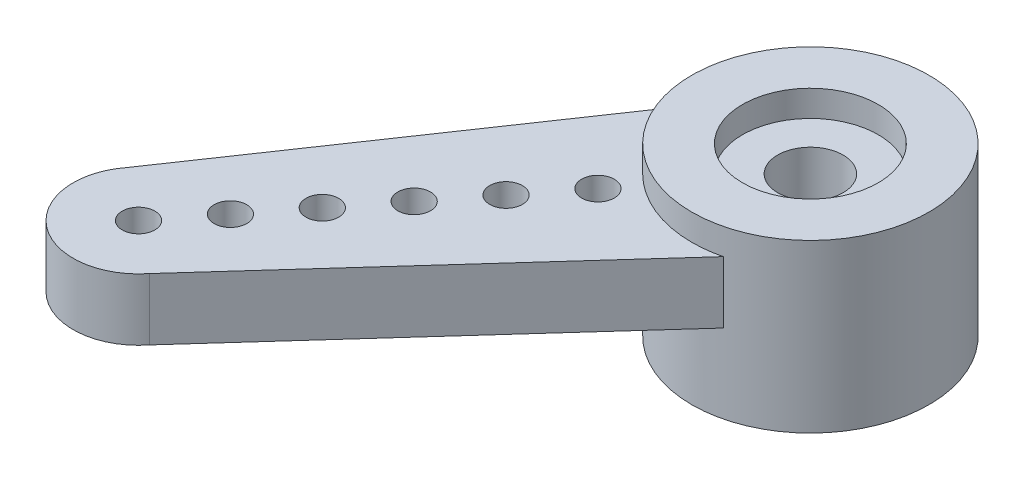
ISO-10303-21;
HEADER;
FILE_DESCRIPTION(('STEP AP214'),'2;1');
FILE_NAME('part.step','',(''),(''),'','','');
FILE_SCHEMA(('AUTOMOTIVE_DESIGN { 1 0 10303 214 1 1 1 1 }'));
ENDSEC;
DATA;
#1=APPLICATION_CONTEXT('core data for automotive mechanical design processes');
#2=APPLICATION_PROTOCOL_DEFINITION('international standard','automotive_design',2000,#1);
#3=PRODUCT_CONTEXT('',#1,'mechanical');
#4=PRODUCT('Part','Part','',(#3));
#5=PRODUCT_RELATED_PRODUCT_CATEGORY('part','',(#4));
#6=PRODUCT_DEFINITION_FORMATION('','',#4);
#7=PRODUCT_DEFINITION_CONTEXT('part definition',#1,'design');
#8=PRODUCT_DEFINITION('design','',#6,#7);
#9=PRODUCT_DEFINITION_SHAPE('','',#8);
#10=(LENGTH_UNIT() NAMED_UNIT(*) SI_UNIT(.MILLI.,.METRE.));
#11=(NAMED_UNIT(*) PLANE_ANGLE_UNIT() SI_UNIT($,.RADIAN.));
#12=(NAMED_UNIT(*) SI_UNIT($,.STERADIAN.) SOLID_ANGLE_UNIT());
#13=UNCERTAINTY_MEASURE_WITH_UNIT(LENGTH_MEASURE(1.E-05),#10,'distance_accuracy_value','');
#14=(GEOMETRIC_REPRESENTATION_CONTEXT(3) GLOBAL_UNCERTAINTY_ASSIGNED_CONTEXT((#13)) GLOBAL_UNIT_ASSIGNED_CONTEXT((#10,
#11,#12)) REPRESENTATION_CONTEXT('',''));
#15=CARTESIAN_POINT('',(0.,0.,0.));
#16=DIRECTION('',(0.,0.,1.));
#17=DIRECTION('',(1.,0.,0.));
#18=AXIS2_PLACEMENT_3D('',#15,#16,#17);
#19=CARTESIAN_POINT('',(0.,4.3,0.));
#20=DIRECTION('',(0.,1.,0.));
#21=DIRECTION('',(0.,0.,1.));
#22=AXIS2_PLACEMENT_3D('',#19,#20,#21);
#23=PLANE('',#22);
#24=CARTESIAN_POINT('',(0.,4.3,0.));
#25=DIRECTION('',(0.,1.,0.));
#26=DIRECTION('',(0.,0.,1.));
#27=AXIS2_PLACEMENT_3D('',#24,#25,#26);
#28=CIRCLE('',#27,1.);
#29=CARTESIAN_POINT('',(0.,4.3,1.));
#30=VERTEX_POINT('',#29);
#31=EDGE_CURVE('E124',#30,#30,#28,.T.);
#32=ORIENTED_EDGE('',*,*,#31,.F.);
#33=EDGE_LOOP('',(#32));
#34=FACE_BOUND('',#33,.T.);
#35=CARTESIAN_POINT('',(0.,4.3,0.));
#36=DIRECTION('',(0.,1.,0.));
#37=DIRECTION('',(0.,0.,1.));
#38=AXIS2_PLACEMENT_3D('',#35,#36,#37);
#39=CIRCLE('',#38,2.075);
#40=CARTESIAN_POINT('',(0.,4.3,2.075));
#41=VERTEX_POINT('',#40);
#42=EDGE_CURVE('E341',#41,#41,#39,.T.);
#43=ORIENTED_EDGE('',*,*,#42,.T.);
#44=EDGE_LOOP('',(#43));
#45=FACE_BOUND('',#44,.T.);
#46=ADVANCED_FACE('F33',(#34,#45),#23,.T.);
#47=CARTESIAN_POINT('',(0.,0.,0.));
#48=DIRECTION('',(0.,1.,0.));
#49=DIRECTION('',(0.,0.,1.));
#50=AXIS2_PLACEMENT_3D('',#47,#48,#49);
#51=PLANE('',#50);
#52=CARTESIAN_POINT('',(0.,0.,0.));
#53=DIRECTION('',(0.,1.,0.));
#54=DIRECTION('',(0.,0.,1.));
#55=AXIS2_PLACEMENT_3D('',#52,#53,#54);
#56=CIRCLE('',#55,3.625);
#57=CARTESIAN_POINT('',(0.,0.,3.625));
#58=VERTEX_POINT('',#57);
#59=EDGE_CURVE('E140',#58,#58,#56,.T.);
#60=ORIENTED_EDGE('',*,*,#59,.F.);
#61=EDGE_LOOP('',(#60));
#62=FACE_BOUND('',#61,.T.);
#63=CARTESIAN_POINT('',(0.,0.,0.));
#64=DIRECTION('',(0.,1.,0.));
#65=DIRECTION('',(0.,0.,1.));
#66=AXIS2_PLACEMENT_3D('',#63,#64,#65);
#67=CIRCLE('',#66,2.075);
#68=CARTESIAN_POINT('',(0.,0.,2.075));
#69=VERTEX_POINT('',#68);
#70=EDGE_CURVE('E98',#69,#69,#67,.T.);
#71=ORIENTED_EDGE('',*,*,#70,.T.);
#72=EDGE_LOOP('',(#71));
#73=FACE_BOUND('',#72,.T.);
#74=ADVANCED_FACE('F146',(#62,#73),#51,.F.);
#75=CARTESIAN_POINT('',(0.,2.41,0.));
#76=DIRECTION('',(0.,-1.,0.));
#77=DIRECTION('',(0.,0.,-1.));
#78=AXIS2_PLACEMENT_3D('',#75,#76,#77);
#79=CYLINDRICAL_SURFACE('',#78,3.625);
#80=CARTESIAN_POINT('',(0.,2.41,0.));
#81=DIRECTION('',(0.,1.,0.));
#82=DIRECTION('',(0.,0.,1.));
#83=AXIS2_PLACEMENT_3D('',#80,#81,#82);
#84=CIRCLE('',#83,3.625);
#85=CARTESIAN_POINT('',(-3.625,2.41,0.));
#86=VERTEX_POINT('',#85);
#87=CARTESIAN_POINT('',(0.859585555161717,2.41,3.52161009672526));
#88=VERTEX_POINT('',#87);
#89=EDGE_CURVE('E42',#86,#88,#84,.T.);
#90=ORIENTED_EDGE('',*,*,#89,.F.);
#91=DIRECTION('',(0.,-1.,0.));
#92=VECTOR('',#91,1.);
#93=CARTESIAN_POINT('',(-3.625,4.3,0.));
#94=LINE('',#93,#92);
#95=CARTESIAN_POINT('',(-3.625,4.3,0.));
#96=VERTEX_POINT('',#95);
#97=EDGE_CURVE('E92',#96,#86,#94,.T.);
#98=ORIENTED_EDGE('',*,*,#97,.F.);
#99=CARTESIAN_POINT('',(0.,4.3,0.));
#100=DIRECTION('',(0.,1.,0.));
#101=DIRECTION('',(0.,0.,1.));
#102=AXIS2_PLACEMENT_3D('',#99,#100,#101);
#103=CIRCLE('',#102,3.625);
#104=CARTESIAN_POINT('',(0.859585555161719,4.3,3.52161009672526));
#105=VERTEX_POINT('',#104);
#106=EDGE_CURVE('E11',#96,#105,#103,.T.);
#107=ORIENTED_EDGE('',*,*,#106,.T.);
#108=DIRECTION('',(0.,-1.,0.));
#109=VECTOR('',#108,1.);
#110=CARTESIAN_POINT('',(0.859585555161717,4.3,3.52161009672526));
#111=LINE('',#110,#109);
#112=EDGE_CURVE('E80',#105,#88,#111,.T.);
#113=ORIENTED_EDGE('',*,*,#112,.T.);
#114=EDGE_LOOP('',(#90,#98,#107,#113));
#115=FACE_BOUND('',#114,.T.);
#116=ORIENTED_EDGE('',*,*,#59,.T.);
#117=EDGE_LOOP('',(#116));
#118=FACE_BOUND('',#117,.T.);
#119=CARTESIAN_POINT('',(0.,5.1,0.));
#120=DIRECTION('',(0.,1.,0.));
#121=DIRECTION('',(0.,0.,1.));
#122=AXIS2_PLACEMENT_3D('',#119,#120,#121);
#123=CIRCLE('',#122,3.625);
#124=CARTESIAN_POINT('',(0.,5.1,3.625));
#125=VERTEX_POINT('',#124);
#126=EDGE_CURVE('E343',#125,#125,#123,.T.);
#127=ORIENTED_EDGE('',*,*,#126,.F.);
#128=EDGE_LOOP('',(#127));
#129=FACE_BOUND('',#128,.T.);
#130=ADVANCED_FACE('F35',(#115,#118,#129),#79,.T.);
#131=CARTESIAN_POINT('',(0.,2.41,0.));
#132=DIRECTION('',(0.,-1.,0.));
#133=DIRECTION('',(0.,0.,-1.));
#134=AXIS2_PLACEMENT_3D('',#131,#132,#133);
#135=CYLINDRICAL_SURFACE('',#134,2.075);
#136=CARTESIAN_POINT('',(0.,2.41,0.));
#137=DIRECTION('',(0.,1.,0.));
#138=DIRECTION('',(0.,0.,1.));
#139=AXIS2_PLACEMENT_3D('',#136,#137,#138);
#140=CIRCLE('',#139,2.075);
#141=CARTESIAN_POINT('',(0.,2.41,2.075));
#142=VERTEX_POINT('',#141);
#143=EDGE_CURVE('E94',#142,#142,#140,.T.);
#144=ORIENTED_EDGE('',*,*,#143,.T.);
#145=EDGE_LOOP('',(#144));
#146=FACE_BOUND('',#145,.T.);
#147=ORIENTED_EDGE('',*,*,#70,.F.);
#148=EDGE_LOOP('',(#147));
#149=FACE_BOUND('',#148,.T.);
#150=ADVANCED_FACE('F151',(#146,#149),#135,.F.);
#151=CARTESIAN_POINT('',(0.,2.41,0.));
#152=DIRECTION('',(0.,1.,0.));
#153=DIRECTION('',(0.,0.,1.));
#154=AXIS2_PLACEMENT_3D('',#151,#152,#153);
#155=PLANE('',#154);
#156=CARTESIAN_POINT('',(-9.03247950828862,2.41,11.5023884012124));
#157=DIRECTION('',(0.,1.,0.));
#158=DIRECTION('',(0.,0.,1.));
#159=AXIS2_PLACEMENT_3D('',#156,#157,#158);
#160=CIRCLE('',#159,0.500000000000001);
#161=CARTESIAN_POINT('',(-9.03247950828862,2.41,12.0023884012124));
#162=VERTEX_POINT('',#161);
#163=EDGE_CURVE('E134',#162,#162,#160,.T.);
#164=ORIENTED_EDGE('',*,*,#163,.T.);
#165=EDGE_LOOP('',(#164));
#166=FACE_BOUND('',#165,.T.);
#167=CARTESIAN_POINT('',(-7.79726863536026,2.41,9.92941220959363));
#168=DIRECTION('',(0.,1.,0.));
#169=DIRECTION('',(0.,0.,1.));
#170=AXIS2_PLACEMENT_3D('',#167,#168,#169);
#171=CIRCLE('',#170,0.5);
#172=CARTESIAN_POINT('',(-7.79726863536026,2.41,10.4294122095936));
#173=VERTEX_POINT('',#172);
#174=EDGE_CURVE('E370',#173,#173,#171,.T.);
#175=ORIENTED_EDGE('',*,*,#174,.T.);
#176=EDGE_LOOP('',(#175));
#177=FACE_BOUND('',#176,.T.);
#178=CARTESIAN_POINT('',(-6.5620577624319,2.41,8.35643601797484));
#179=DIRECTION('',(0.,1.,0.));
#180=DIRECTION('',(0.,0.,1.));
#181=AXIS2_PLACEMENT_3D('',#178,#179,#180);
#182=CIRCLE('',#181,0.500000000000001);
#183=CARTESIAN_POINT('',(-6.5620577624319,2.41,8.85643601797484));
#184=VERTEX_POINT('',#183);
#185=EDGE_CURVE('E364',#184,#184,#182,.T.);
#186=ORIENTED_EDGE('',*,*,#185,.T.);
#187=EDGE_LOOP('',(#186));
#188=FACE_BOUND('',#187,.T.);
#189=CARTESIAN_POINT('',(-5.32684688950354,2.41,6.78345982635605));
#190=DIRECTION('',(0.,1.,0.));
#191=DIRECTION('',(0.,0.,1.));
#192=AXIS2_PLACEMENT_3D('',#189,#190,#191);
#193=CIRCLE('',#192,0.5);
#194=CARTESIAN_POINT('',(-5.32684688950354,2.41,7.28345982635605));
#195=VERTEX_POINT('',#194);
#196=EDGE_CURVE('E358',#195,#195,#193,.T.);
#197=ORIENTED_EDGE('',*,*,#196,.T.);
#198=EDGE_LOOP('',(#197));
#199=FACE_BOUND('',#198,.T.);
#200=CARTESIAN_POINT('',(-4.09163601657519,2.41,5.21048363473725));
#201=DIRECTION('',(0.,1.,0.));
#202=DIRECTION('',(0.,0.,1.));
#203=AXIS2_PLACEMENT_3D('',#200,#201,#202);
#204=CIRCLE('',#203,0.5);
#205=CARTESIAN_POINT('',(-4.09163601657519,2.41,5.71048363473725));
#206=VERTEX_POINT('',#205);
#207=EDGE_CURVE('E352',#206,#206,#204,.T.);
#208=ORIENTED_EDGE('',*,*,#207,.T.);
#209=EDGE_LOOP('',(#208));
#210=FACE_BOUND('',#209,.T.);
#211=CARTESIAN_POINT('',(-2.85642514364683,2.41,3.63750744311846));
#212=DIRECTION('',(0.,1.,0.));
#213=DIRECTION('',(0.,0.,1.));
#214=AXIS2_PLACEMENT_3D('',#211,#212,#213);
#215=CIRCLE('',#214,0.5);
#216=CARTESIAN_POINT('',(-2.85642514364683,2.41,4.13750744311846));
#217=VERTEX_POINT('',#216);
#218=EDGE_CURVE('E348',#217,#217,#215,.T.);
#219=ORIENTED_EDGE('',*,*,#218,.T.);
#220=EDGE_LOOP('',(#219));
#221=FACE_BOUND('',#220,.T.);
#222=DIRECTION('',(-0.562242548605768,0.,0.826972379549215));
#223=VECTOR('',#222,1.);
#224=CARTESIAN_POINT('',(-10.6054556999074,2.41,10.2671775282841));
#225=LINE('',#224,#223);
#226=CARTESIAN_POINT('',(-10.6054556999074,2.41,10.2671775282841));
#227=VERTEX_POINT('',#226);
#228=EDGE_CURVE('E116',#86,#227,#225,.T.);
#229=ORIENTED_EDGE('',*,*,#228,.F.);
#230=ORIENTED_EDGE('',*,*,#89,.T.);
#231=DIRECTION('',(0.670063091932306,0.,-0.742304151160505));
#232=VECTOR('',#231,1.);
#233=CARTESIAN_POINT('',(-7.45950331666982,2.41,12.7375992741408));
#234=LINE('',#233,#232);
#235=CARTESIAN_POINT('',(-7.45950331666982,2.41,12.7375992741408));
#236=VERTEX_POINT('',#235);
#237=EDGE_CURVE('E84',#236,#88,#234,.T.);
#238=ORIENTED_EDGE('',*,*,#237,.F.);
#239=CARTESIAN_POINT('',(-9.03247950828862,2.41,11.5023884012124));
#240=DIRECTION('',(0.,1.,0.));
#241=DIRECTION('',(0.,0.,1.));
#242=AXIS2_PLACEMENT_3D('',#239,#240,#241);
#243=CIRCLE('',#242,2.);
#244=EDGE_CURVE('E114',#227,#236,#243,.T.);
#245=ORIENTED_EDGE('',*,*,#244,.F.);
#246=EDGE_LOOP('',(#229,#230,#238,#245));
#247=FACE_BOUND('',#246,.T.);
#248=ADVANCED_FACE('F153',(#166,#177,#188,#199,#210,#221,#247),#155,.F.);
#249=ORIENTED_EDGE('',*,*,#106,.F.);
#250=DIRECTION('',(-0.562242548605768,0.,0.826972379549215));
#251=VECTOR('',#250,1.);
#252=CARTESIAN_POINT('',(-10.6054556999074,4.3,10.2671775282841));
#253=LINE('',#252,#251);
#254=CARTESIAN_POINT('',(-10.6054556999074,4.3,10.2671775282841));
#255=VERTEX_POINT('',#254);
#256=EDGE_CURVE('E111',#96,#255,#253,.T.);
#257=ORIENTED_EDGE('',*,*,#256,.T.);
#258=CARTESIAN_POINT('',(-9.03247950828862,4.3,11.5023884012124));
#259=DIRECTION('',(0.,1.,0.));
#260=DIRECTION('',(0.,0.,1.));
#261=AXIS2_PLACEMENT_3D('',#258,#259,#260);
#262=CIRCLE('',#261,2.);
#263=CARTESIAN_POINT('',(-7.45950331666982,4.3,12.7375992741408));
#264=VERTEX_POINT('',#263);
#265=EDGE_CURVE('E58',#255,#264,#262,.T.);
#266=ORIENTED_EDGE('',*,*,#265,.T.);
#267=DIRECTION('',(0.670063091932306,0.,-0.742304151160505));
#268=VECTOR('',#267,1.);
#269=CARTESIAN_POINT('',(-7.45950331666982,4.3,12.7375992741408));
#270=LINE('',#269,#268);
#271=EDGE_CURVE('E83',#264,#105,#270,.T.);
#272=ORIENTED_EDGE('',*,*,#271,.T.);
#273=EDGE_LOOP('',(#249,#257,#266,#272));
#274=FACE_BOUND('',#273,.T.);
#275=CARTESIAN_POINT('',(-4.09163601657519,4.3,5.21048363473725));
#276=DIRECTION('',(0.,1.,0.));
#277=DIRECTION('',(0.,0.,1.));
#278=AXIS2_PLACEMENT_3D('',#275,#276,#277);
#279=CIRCLE('',#278,0.5);
#280=CARTESIAN_POINT('',(-4.09163601657519,4.3,5.71048363473725));
#281=VERTEX_POINT('',#280);
#282=EDGE_CURVE('E355',#281,#281,#279,.T.);
#283=ORIENTED_EDGE('',*,*,#282,.F.);
#284=EDGE_LOOP('',(#283));
#285=FACE_BOUND('',#284,.T.);
#286=CARTESIAN_POINT('',(-6.5620577624319,4.3,8.35643601797484));
#287=DIRECTION('',(0.,1.,0.));
#288=DIRECTION('',(0.,0.,1.));
#289=AXIS2_PLACEMENT_3D('',#286,#287,#288);
#290=CIRCLE('',#289,0.500000000000001);
#291=CARTESIAN_POINT('',(-6.5620577624319,4.3,8.85643601797484));
#292=VERTEX_POINT('',#291);
#293=EDGE_CURVE('E367',#292,#292,#290,.T.);
#294=ORIENTED_EDGE('',*,*,#293,.F.);
#295=EDGE_LOOP('',(#294));
#296=FACE_BOUND('',#295,.T.);
#297=CARTESIAN_POINT('',(-9.03247950828862,4.3,11.5023884012124));
#298=DIRECTION('',(0.,1.,0.));
#299=DIRECTION('',(0.,0.,1.));
#300=AXIS2_PLACEMENT_3D('',#297,#298,#299);
#301=CIRCLE('',#300,0.500000000000001);
#302=CARTESIAN_POINT('',(-9.03247950828862,4.3,12.0023884012124));
#303=VERTEX_POINT('',#302);
#304=EDGE_CURVE('E131',#303,#303,#301,.T.);
#305=ORIENTED_EDGE('',*,*,#304,.F.);
#306=EDGE_LOOP('',(#305));
#307=FACE_BOUND('',#306,.T.);
#308=CARTESIAN_POINT('',(-7.79726863536026,4.3,9.92941220959363));
#309=DIRECTION('',(0.,1.,0.));
#310=DIRECTION('',(0.,0.,1.));
#311=AXIS2_PLACEMENT_3D('',#308,#309,#310);
#312=CIRCLE('',#311,0.5);
#313=CARTESIAN_POINT('',(-7.79726863536026,4.3,10.4294122095936));
#314=VERTEX_POINT('',#313);
#315=EDGE_CURVE('E373',#314,#314,#312,.T.);
#316=ORIENTED_EDGE('',*,*,#315,.F.);
#317=EDGE_LOOP('',(#316));
#318=FACE_BOUND('',#317,.T.);
#319=CARTESIAN_POINT('',(-5.32684688950354,4.3,6.78345982635605));
#320=DIRECTION('',(0.,1.,0.));
#321=DIRECTION('',(0.,0.,1.));
#322=AXIS2_PLACEMENT_3D('',#319,#320,#321);
#323=CIRCLE('',#322,0.5);
#324=CARTESIAN_POINT('',(-5.32684688950354,4.3,7.28345982635605));
#325=VERTEX_POINT('',#324);
#326=EDGE_CURVE('E361',#325,#325,#323,.T.);
#327=ORIENTED_EDGE('',*,*,#326,.F.);
#328=EDGE_LOOP('',(#327));
#329=FACE_BOUND('',#328,.T.);
#330=CARTESIAN_POINT('',(-2.85642514364683,4.3,3.63750744311846));
#331=DIRECTION('',(0.,1.,0.));
#332=DIRECTION('',(0.,0.,1.));
#333=AXIS2_PLACEMENT_3D('',#330,#331,#332);
#334=CIRCLE('',#333,0.5);
#335=CARTESIAN_POINT('',(-2.85642514364683,4.3,4.13750744311846));
#336=VERTEX_POINT('',#335);
#337=EDGE_CURVE('E349',#336,#336,#334,.T.);
#338=ORIENTED_EDGE('',*,*,#337,.F.);
#339=EDGE_LOOP('',(#338));
#340=FACE_BOUND('',#339,.T.);
#341=ADVANCED_FACE('F87',(#274,#285,#296,#307,#318,#329,#340),#23,.T.);
#342=ORIENTED_EDGE('',*,*,#143,.F.);
#343=EDGE_LOOP('',(#342));
#344=FACE_BOUND('',#343,.T.);
#345=CARTESIAN_POINT('',(0.,2.41,0.));
#346=DIRECTION('',(0.,1.,0.));
#347=DIRECTION('',(0.,0.,1.));
#348=AXIS2_PLACEMENT_3D('',#345,#346,#347);
#349=CIRCLE('',#348,1.);
#350=CARTESIAN_POINT('',(0.,2.41,1.));
#351=VERTEX_POINT('',#350);
#352=EDGE_CURVE('E126',#351,#351,#349,.T.);
#353=ORIENTED_EDGE('',*,*,#352,.T.);
#354=EDGE_LOOP('',(#353));
#355=FACE_BOUND('',#354,.T.);
#356=ADVANCED_FACE('F162',(#344,#355),#155,.F.);
#357=CARTESIAN_POINT('',(-10.6054556999074,4.3,10.2671775282841));
#358=DIRECTION('',(0.826972379549215,0.,0.562242548605768));
#359=DIRECTION('',(0.562242548605768,0.,-0.826972379549215));
#360=AXIS2_PLACEMENT_3D('',#357,#358,#359);
#361=PLANE('',#360);
#362=ORIENTED_EDGE('',*,*,#228,.T.);
#363=DIRECTION('',(0.,-1.,0.));
#364=VECTOR('',#363,1.);
#365=CARTESIAN_POINT('',(-10.6054556999074,4.3,10.2671775282841));
#366=LINE('',#365,#364);
#367=EDGE_CURVE('E95',#255,#227,#366,.T.);
#368=ORIENTED_EDGE('',*,*,#367,.F.);
#369=ORIENTED_EDGE('',*,*,#256,.F.);
#370=ORIENTED_EDGE('',*,*,#97,.T.);
#371=EDGE_LOOP('',(#362,#368,#369,#370));
#372=FACE_BOUND('',#371,.T.);
#373=ADVANCED_FACE('F175',(#372),#361,.F.);
#374=CARTESIAN_POINT('',(-9.03247950828862,4.3,11.5023884012124));
#375=DIRECTION('',(0.,-1.,0.));
#376=DIRECTION('',(0.,0.,-1.));
#377=AXIS2_PLACEMENT_3D('',#374,#375,#376);
#378=CYLINDRICAL_SURFACE('',#377,2.);
#379=ORIENTED_EDGE('',*,*,#244,.T.);
#380=DIRECTION('',(0.,-1.,0.));
#381=VECTOR('',#380,1.);
#382=CARTESIAN_POINT('',(-7.45950331666982,4.3,12.7375992741408));
#383=LINE('',#382,#381);
#384=EDGE_CURVE('E85',#264,#236,#383,.T.);
#385=ORIENTED_EDGE('',*,*,#384,.F.);
#386=ORIENTED_EDGE('',*,*,#265,.F.);
#387=ORIENTED_EDGE('',*,*,#367,.T.);
#388=EDGE_LOOP('',(#379,#385,#386,#387));
#389=FACE_BOUND('',#388,.T.);
#390=ADVANCED_FACE('F180',(#389),#378,.T.);
#391=CARTESIAN_POINT('',(-7.45950331666982,4.3,12.7375992741408));
#392=DIRECTION('',(-0.742304151160505,0.,-0.670063091932306));
#393=DIRECTION('',(-0.670063091932306,0.,0.742304151160505));
#394=AXIS2_PLACEMENT_3D('',#391,#392,#393);
#395=PLANE('',#394);
#396=ORIENTED_EDGE('',*,*,#237,.T.);
#397=ORIENTED_EDGE('',*,*,#112,.F.);
#398=ORIENTED_EDGE('',*,*,#271,.F.);
#399=ORIENTED_EDGE('',*,*,#384,.T.);
#400=EDGE_LOOP('',(#396,#397,#398,#399));
#401=FACE_BOUND('',#400,.T.);
#402=ADVANCED_FACE('F81',(#401),#395,.F.);
#403=CARTESIAN_POINT('',(0.,4.3,0.));
#404=DIRECTION('',(0.,-1.,0.));
#405=DIRECTION('',(0.,0.,-1.));
#406=AXIS2_PLACEMENT_3D('',#403,#404,#405);
#407=CYLINDRICAL_SURFACE('',#406,1.);
#408=ORIENTED_EDGE('',*,*,#31,.T.);
#409=EDGE_LOOP('',(#408));
#410=FACE_BOUND('',#409,.T.);
#411=ORIENTED_EDGE('',*,*,#352,.F.);
#412=EDGE_LOOP('',(#411));
#413=FACE_BOUND('',#412,.T.);
#414=ADVANCED_FACE('F186',(#410,#413),#407,.F.);
#415=CARTESIAN_POINT('',(-9.03247950828862,4.3,11.5023884012124));
#416=DIRECTION('',(0.,-1.,0.));
#417=DIRECTION('',(0.,0.,-1.));
#418=AXIS2_PLACEMENT_3D('',#415,#416,#417);
#419=CYLINDRICAL_SURFACE('',#418,0.500000000000001);
#420=ORIENTED_EDGE('',*,*,#304,.T.);
#421=EDGE_LOOP('',(#420));
#422=FACE_BOUND('',#421,.T.);
#423=ORIENTED_EDGE('',*,*,#163,.F.);
#424=EDGE_LOOP('',(#423));
#425=FACE_BOUND('',#424,.T.);
#426=ADVANCED_FACE('F205',(#422,#425),#419,.F.);
#427=CARTESIAN_POINT('',(-7.79726863536026,4.3,9.92941220959363));
#428=DIRECTION('',(0.,-1.,0.));
#429=DIRECTION('',(0.,0.,-1.));
#430=AXIS2_PLACEMENT_3D('',#427,#428,#429);
#431=CYLINDRICAL_SURFACE('',#430,0.5);
#432=ORIENTED_EDGE('',*,*,#315,.T.);
#433=EDGE_LOOP('',(#432));
#434=FACE_BOUND('',#433,.T.);
#435=ORIENTED_EDGE('',*,*,#174,.F.);
#436=EDGE_LOOP('',(#435));
#437=FACE_BOUND('',#436,.T.);
#438=ADVANCED_FACE('F211',(#434,#437),#431,.F.);
#439=CARTESIAN_POINT('',(-6.5620577624319,4.3,8.35643601797484));
#440=DIRECTION('',(0.,-1.,0.));
#441=DIRECTION('',(0.,0.,-1.));
#442=AXIS2_PLACEMENT_3D('',#439,#440,#441);
#443=CYLINDRICAL_SURFACE('',#442,0.500000000000001);
#444=ORIENTED_EDGE('',*,*,#293,.T.);
#445=EDGE_LOOP('',(#444));
#446=FACE_BOUND('',#445,.T.);
#447=ORIENTED_EDGE('',*,*,#185,.F.);
#448=EDGE_LOOP('',(#447));
#449=FACE_BOUND('',#448,.T.);
#450=ADVANCED_FACE('F219',(#446,#449),#443,.F.);
#451=CARTESIAN_POINT('',(-5.32684688950354,4.3,6.78345982635605));
#452=DIRECTION('',(0.,-1.,0.));
#453=DIRECTION('',(0.,0.,-1.));
#454=AXIS2_PLACEMENT_3D('',#451,#452,#453);
#455=CYLINDRICAL_SURFACE('',#454,0.5);
#456=ORIENTED_EDGE('',*,*,#326,.T.);
#457=EDGE_LOOP('',(#456));
#458=FACE_BOUND('',#457,.T.);
#459=ORIENTED_EDGE('',*,*,#196,.F.);
#460=EDGE_LOOP('',(#459));
#461=FACE_BOUND('',#460,.T.);
#462=ADVANCED_FACE('F227',(#458,#461),#455,.F.);
#463=CARTESIAN_POINT('',(-4.09163601657519,4.3,5.21048363473725));
#464=DIRECTION('',(0.,-1.,0.));
#465=DIRECTION('',(0.,0.,-1.));
#466=AXIS2_PLACEMENT_3D('',#463,#464,#465);
#467=CYLINDRICAL_SURFACE('',#466,0.5);
#468=ORIENTED_EDGE('',*,*,#282,.T.);
#469=EDGE_LOOP('',(#468));
#470=FACE_BOUND('',#469,.T.);
#471=ORIENTED_EDGE('',*,*,#207,.F.);
#472=EDGE_LOOP('',(#471));
#473=FACE_BOUND('',#472,.T.);
#474=ADVANCED_FACE('F235',(#470,#473),#467,.F.);
#475=CARTESIAN_POINT('',(-2.85642514364683,4.3,3.63750744311846));
#476=DIRECTION('',(0.,-1.,0.));
#477=DIRECTION('',(0.,0.,-1.));
#478=AXIS2_PLACEMENT_3D('',#475,#476,#477);
#479=CYLINDRICAL_SURFACE('',#478,0.5);
#480=ORIENTED_EDGE('',*,*,#337,.T.);
#481=EDGE_LOOP('',(#480));
#482=FACE_BOUND('',#481,.T.);
#483=ORIENTED_EDGE('',*,*,#218,.F.);
#484=EDGE_LOOP('',(#483));
#485=FACE_BOUND('',#484,.T.);
#486=ADVANCED_FACE('F243',(#482,#485),#479,.F.);
#487=CARTESIAN_POINT('',(0.,5.1,0.));
#488=DIRECTION('',(0.,1.,0.));
#489=DIRECTION('',(0.,0.,1.));
#490=AXIS2_PLACEMENT_3D('',#487,#488,#489);
#491=PLANE('',#490);
#492=ORIENTED_EDGE('',*,*,#126,.T.);
#493=EDGE_LOOP('',(#492));
#494=FACE_BOUND('',#493,.T.);
#495=CARTESIAN_POINT('',(0.,5.1,0.));
#496=DIRECTION('',(0.,1.,0.));
#497=DIRECTION('',(0.,0.,1.));
#498=AXIS2_PLACEMENT_3D('',#495,#496,#497);
#499=CIRCLE('',#498,2.075);
#500=CARTESIAN_POINT('',(0.,5.1,2.075));
#501=VERTEX_POINT('',#500);
#502=EDGE_CURVE('E338',#501,#501,#499,.T.);
#503=ORIENTED_EDGE('',*,*,#502,.F.);
#504=EDGE_LOOP('',(#503));
#505=FACE_BOUND('',#504,.T.);
#506=ADVANCED_FACE('F251',(#494,#505),#491,.T.);
#507=CARTESIAN_POINT('',(0.,5.1,0.));
#508=DIRECTION('',(0.,-1.,0.));
#509=DIRECTION('',(0.,0.,-1.));
#510=AXIS2_PLACEMENT_3D('',#507,#508,#509);
#511=CYLINDRICAL_SURFACE('',#510,2.075);
#512=ORIENTED_EDGE('',*,*,#502,.T.);
#513=EDGE_LOOP('',(#512));
#514=FACE_BOUND('',#513,.T.);
#515=ORIENTED_EDGE('',*,*,#42,.F.);
#516=EDGE_LOOP('',(#515));
#517=FACE_BOUND('',#516,.T.);
#518=ADVANCED_FACE('F258',(#514,#517),#511,.F.);
#519=CLOSED_SHELL('',(#46,#74,#130,#150,#248,#341,#356,#373,#390,#402,#414,#426,#438,#450,#462,
#474,#486,#506,#518));
#520=MANIFOLD_SOLID_BREP('B2',#519);
#521=ADVANCED_BREP_SHAPE_REPRESENTATION('',(#18,#520),#14);
#522=SHAPE_DEFINITION_REPRESENTATION(#9,#521);
ENDSEC;
END-ISO-10303-21;
